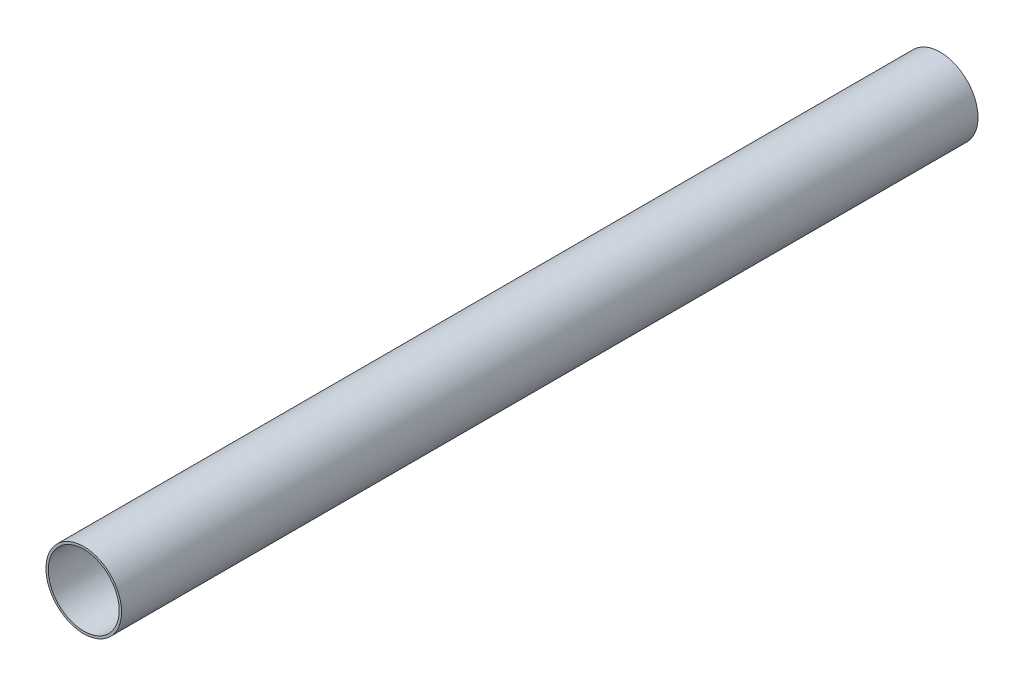
ISO-10303-21;
HEADER;
FILE_DESCRIPTION(('STEP AP214'),'2;1');
FILE_NAME('part.step','',(''),(''),'','','');
FILE_SCHEMA(('AUTOMOTIVE_DESIGN { 1 0 10303 214 1 1 1 1 }'));
ENDSEC;
DATA;
#1=APPLICATION_CONTEXT('core data for automotive mechanical design processes');
#2=APPLICATION_PROTOCOL_DEFINITION('international standard','automotive_design',2000,#1);
#3=PRODUCT_CONTEXT('',#1,'mechanical');
#4=PRODUCT('Part','Part','',(#3));
#5=PRODUCT_RELATED_PRODUCT_CATEGORY('part','',(#4));
#6=PRODUCT_DEFINITION_FORMATION('','',#4);
#7=PRODUCT_DEFINITION_CONTEXT('part definition',#1,'design');
#8=PRODUCT_DEFINITION('design','',#6,#7);
#9=PRODUCT_DEFINITION_SHAPE('','',#8);
#10=(LENGTH_UNIT() NAMED_UNIT(*) SI_UNIT(.MILLI.,.METRE.));
#11=(NAMED_UNIT(*) PLANE_ANGLE_UNIT() SI_UNIT($,.RADIAN.));
#12=(NAMED_UNIT(*) SI_UNIT($,.STERADIAN.) SOLID_ANGLE_UNIT());
#13=UNCERTAINTY_MEASURE_WITH_UNIT(LENGTH_MEASURE(1.E-05),#10,'distance_accuracy_value','');
#14=(GEOMETRIC_REPRESENTATION_CONTEXT(3) GLOBAL_UNCERTAINTY_ASSIGNED_CONTEXT((#13)) GLOBAL_UNIT_ASSIGNED_CONTEXT((#10,
#11,#12)) REPRESENTATION_CONTEXT('',''));
#15=CARTESIAN_POINT('',(0.,0.,0.));
#16=DIRECTION('',(0.,0.,1.));
#17=DIRECTION('',(1.,0.,0.));
#18=AXIS2_PLACEMENT_3D('',#15,#16,#17);
#19=CARTESIAN_POINT('',(0.,0.,287.606496287));
#20=DIRECTION('',(0.,0.,1.));
#21=DIRECTION('',(1.,0.,0.));
#22=AXIS2_PLACEMENT_3D('',#19,#20,#21);
#23=PLANE('',#22);
#24=CARTESIAN_POINT('',(0.,0.,287.606496287));
#25=DIRECTION('',(0.,0.,1.));
#26=DIRECTION('',(1.,0.,0.));
#27=AXIS2_PLACEMENT_3D('',#24,#25,#26);
#28=CIRCLE('',#27,25.4);
#29=CARTESIAN_POINT('',(25.4,0.,287.606496287));
#30=VERTEX_POINT('',#29);
#31=EDGE_CURVE('E10',#30,#30,#28,.T.);
#32=ORIENTED_EDGE('',*,*,#31,.T.);
#33=EDGE_LOOP('',(#32));
#34=FACE_BOUND('',#33,.T.);
#35=CARTESIAN_POINT('',(0.,0.,287.606496287));
#36=DIRECTION('',(0.,0.,1.));
#37=DIRECTION('',(1.,0.,0.));
#38=AXIS2_PLACEMENT_3D('',#35,#36,#37);
#39=CIRCLE('',#38,23.8125);
#40=CARTESIAN_POINT('',(23.8125,0.,287.606496287));
#41=VERTEX_POINT('',#40);
#42=EDGE_CURVE('E47',#41,#41,#39,.T.);
#43=ORIENTED_EDGE('',*,*,#42,.F.);
#44=EDGE_LOOP('',(#43));
#45=FACE_BOUND('',#44,.T.);
#46=ADVANCED_FACE('F36',(#34,#45),#23,.T.);
#47=CARTESIAN_POINT('',(0.,0.,-287.606496287));
#48=DIRECTION('',(0.,0.,1.));
#49=DIRECTION('',(1.,0.,0.));
#50=AXIS2_PLACEMENT_3D('',#47,#48,#49);
#51=PLANE('',#50);
#52=CARTESIAN_POINT('',(0.,0.,-287.606496287));
#53=DIRECTION('',(0.,0.,1.));
#54=DIRECTION('',(1.,0.,0.));
#55=AXIS2_PLACEMENT_3D('',#52,#53,#54);
#56=CIRCLE('',#55,25.4);
#57=CARTESIAN_POINT('',(25.4,0.,-287.606496287));
#58=VERTEX_POINT('',#57);
#59=EDGE_CURVE('E40',#58,#58,#56,.T.);
#60=ORIENTED_EDGE('',*,*,#59,.F.);
#61=EDGE_LOOP('',(#60));
#62=FACE_BOUND('',#61,.T.);
#63=CARTESIAN_POINT('',(0.,0.,-287.606496287));
#64=DIRECTION('',(0.,0.,1.));
#65=DIRECTION('',(1.,0.,0.));
#66=AXIS2_PLACEMENT_3D('',#63,#64,#65);
#67=CIRCLE('',#66,23.8125);
#68=CARTESIAN_POINT('',(23.8125,0.,-287.606496287));
#69=VERTEX_POINT('',#68);
#70=EDGE_CURVE('E49',#69,#69,#67,.T.);
#71=ORIENTED_EDGE('',*,*,#70,.T.);
#72=EDGE_LOOP('',(#71));
#73=FACE_BOUND('',#72,.T.);
#74=ADVANCED_FACE('F59',(#62,#73),#51,.F.);
#75=CARTESIAN_POINT('',(0.,0.,287.606496287));
#76=DIRECTION('',(0.,0.,-1.));
#77=DIRECTION('',(-1.,0.,0.));
#78=AXIS2_PLACEMENT_3D('',#75,#76,#77);
#79=CYLINDRICAL_SURFACE('',#78,25.4);
#80=ORIENTED_EDGE('',*,*,#31,.F.);
#81=EDGE_LOOP('',(#80));
#82=FACE_BOUND('',#81,.T.);
#83=ORIENTED_EDGE('',*,*,#59,.T.);
#84=EDGE_LOOP('',(#83));
#85=FACE_BOUND('',#84,.T.);
#86=ADVANCED_FACE('F38',(#82,#85),#79,.T.);
#87=CARTESIAN_POINT('',(0.,0.,287.606496287));
#88=DIRECTION('',(0.,0.,-1.));
#89=DIRECTION('',(-1.,0.,0.));
#90=AXIS2_PLACEMENT_3D('',#87,#88,#89);
#91=CYLINDRICAL_SURFACE('',#90,23.8125);
#92=ORIENTED_EDGE('',*,*,#42,.T.);
#93=EDGE_LOOP('',(#92));
#94=FACE_BOUND('',#93,.T.);
#95=ORIENTED_EDGE('',*,*,#70,.F.);
#96=EDGE_LOOP('',(#95));
#97=FACE_BOUND('',#96,.T.);
#98=ADVANCED_FACE('F55',(#94,#97),#91,.F.);
#99=CLOSED_SHELL('',(#46,#74,#86,#98));
#100=MANIFOLD_SOLID_BREP('B2',#99);
#101=ADVANCED_BREP_SHAPE_REPRESENTATION('',(#18,#100),#14);
#102=SHAPE_DEFINITION_REPRESENTATION(#9,#101);
ENDSEC;
END-ISO-10303-21;
